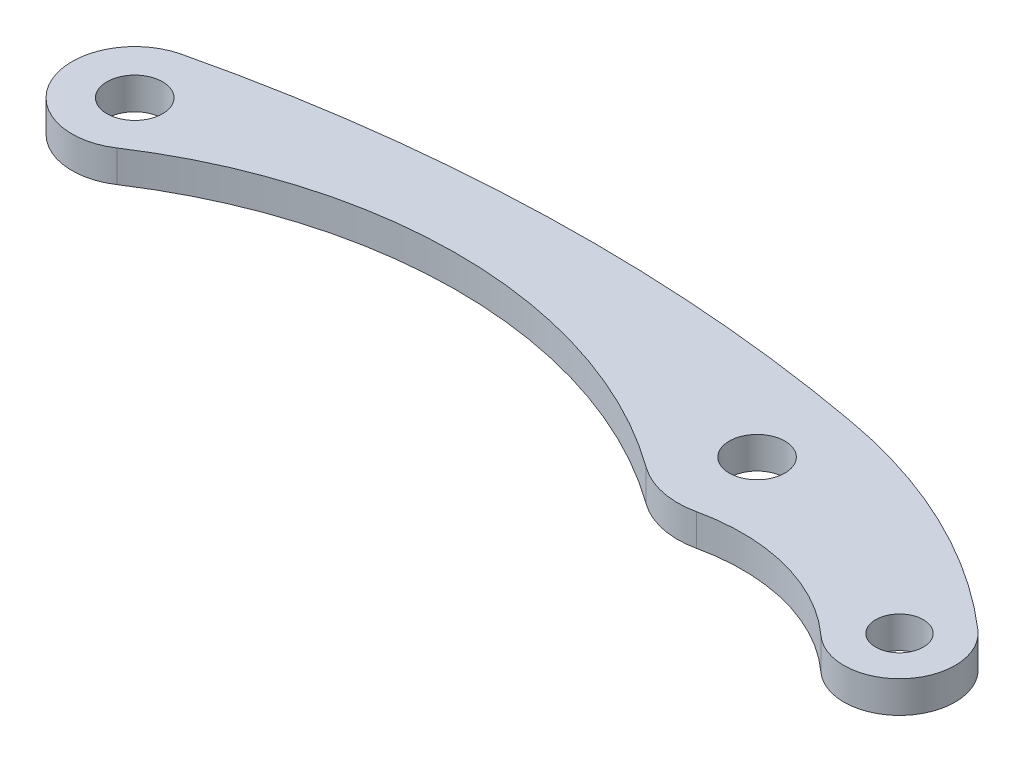
ISO-10303-21;
HEADER;
FILE_DESCRIPTION(('STEP AP214'),'2;1');
FILE_NAME('part.step','',(''),(''),'','','');
FILE_SCHEMA(('AUTOMOTIVE_DESIGN { 1 0 10303 214 1 1 1 1 }'));
ENDSEC;
DATA;
#1=APPLICATION_CONTEXT('core data for automotive mechanical design processes');
#2=APPLICATION_PROTOCOL_DEFINITION('international standard','automotive_design',2000,#1);
#3=PRODUCT_CONTEXT('',#1,'mechanical');
#4=PRODUCT('Part','Part','',(#3));
#5=PRODUCT_RELATED_PRODUCT_CATEGORY('part','',(#4));
#6=PRODUCT_DEFINITION_FORMATION('','',#4);
#7=PRODUCT_DEFINITION_CONTEXT('part definition',#1,'design');
#8=PRODUCT_DEFINITION('design','',#6,#7);
#9=PRODUCT_DEFINITION_SHAPE('','',#8);
#10=(LENGTH_UNIT() NAMED_UNIT(*) SI_UNIT(.MILLI.,.METRE.));
#11=(NAMED_UNIT(*) PLANE_ANGLE_UNIT() SI_UNIT($,.RADIAN.));
#12=(NAMED_UNIT(*) SI_UNIT($,.STERADIAN.) SOLID_ANGLE_UNIT());
#13=UNCERTAINTY_MEASURE_WITH_UNIT(LENGTH_MEASURE(1.E-05),#10,'distance_accuracy_value','');
#14=(GEOMETRIC_REPRESENTATION_CONTEXT(3) GLOBAL_UNCERTAINTY_ASSIGNED_CONTEXT((#13)) GLOBAL_UNIT_ASSIGNED_CONTEXT((#10,
#11,#12)) REPRESENTATION_CONTEXT('',''));
#15=CARTESIAN_POINT('',(0.,0.,0.));
#16=DIRECTION('',(0.,0.,1.));
#17=DIRECTION('',(1.,0.,0.));
#18=AXIS2_PLACEMENT_3D('',#15,#16,#17);
#19=CARTESIAN_POINT('',(39.178405,2.,0.));
#20=DIRECTION('',(0.,-1.,0.));
#21=DIRECTION('',(0.,0.,-1.));
#22=AXIS2_PLACEMENT_3D('',#19,#20,#21);
#23=CYLINDRICAL_SURFACE('',#22,5.);
#24=CARTESIAN_POINT('',(39.178405,0.,0.));
#25=DIRECTION('',(0.,1.,0.));
#26=DIRECTION('',(0.,0.,1.));
#27=AXIS2_PLACEMENT_3D('',#24,#25,#26);
#28=CIRCLE('',#27,5.);
#29=CARTESIAN_POINT('',(36.2479551434965,0.,4.05122989208442));
#30=VERTEX_POINT('',#29);
#31=CARTESIAN_POINT('',(40.257507506043,0.,4.8821652759254));
#32=VERTEX_POINT('',#31);
#33=EDGE_CURVE('E134',#30,#32,#28,.T.);
#34=ORIENTED_EDGE('',*,*,#33,.T.);
#35=DIRECTION('',(0.,-1.,0.));
#36=VECTOR('',#35,1.);
#37=CARTESIAN_POINT('',(40.257507506043,2.,4.8821652759254));
#38=LINE('',#37,#36);
#39=CARTESIAN_POINT('',(40.257507506043,2.,4.8821652759254));
#40=VERTEX_POINT('',#39);
#41=EDGE_CURVE('E11',#40,#32,#38,.T.);
#42=ORIENTED_EDGE('',*,*,#41,.F.);
#43=CARTESIAN_POINT('',(39.178405,2.,0.));
#44=DIRECTION('',(0.,1.,0.));
#45=DIRECTION('',(0.,0.,1.));
#46=AXIS2_PLACEMENT_3D('',#43,#44,#45);
#47=CIRCLE('',#46,5.);
#48=CARTESIAN_POINT('',(36.2479551434965,2.,4.05122989208442));
#49=VERTEX_POINT('',#48);
#50=EDGE_CURVE('E294',#49,#40,#47,.T.);
#51=ORIENTED_EDGE('',*,*,#50,.F.);
#52=DIRECTION('',(0.,-1.,0.));
#53=VECTOR('',#52,1.);
#54=CARTESIAN_POINT('',(36.2479551434965,2.,4.05122989208442));
#55=LINE('',#54,#53);
#56=EDGE_CURVE('E126',#49,#30,#55,.T.);
#57=ORIENTED_EDGE('',*,*,#56,.T.);
#58=EDGE_LOOP('',(#34,#42,#51,#57));
#59=FACE_BOUND('',#58,.T.);
#60=ADVANCED_FACE('F35',(#59),#23,.T.);
#61=CARTESIAN_POINT('',(42.8473535205461,2.,16.5993619381464));
#62=DIRECTION('',(0.,-1.,0.));
#63=DIRECTION('',(0.,0.,-1.));
#64=AXIS2_PLACEMENT_3D('',#61,#62,#63);
#65=CYLINDRICAL_SURFACE('',#64,12.);
#66=CARTESIAN_POINT('',(42.8473535205461,0.,16.5993619381464));
#67=DIRECTION('',(0.,1.,0.));
#68=DIRECTION('',(0.,0.,1.));
#69=AXIS2_PLACEMENT_3D('',#66,#67,#68);
#70=CIRCLE('',#69,12.);
#71=CARTESIAN_POINT('',(50.9194367137661,0.,7.72008984400857));
#72=VERTEX_POINT('',#71);
#73=EDGE_CURVE('E137',#32,#72,#70,.F.);
#74=ORIENTED_EDGE('',*,*,#73,.T.);
#75=DIRECTION('',(0.,-1.,0.));
#76=VECTOR('',#75,1.);
#77=CARTESIAN_POINT('',(50.9194367137661,2.,7.72008984400857));
#78=LINE('',#77,#76);
#79=CARTESIAN_POINT('',(50.9194367137661,2.,7.72008984400857));
#80=VERTEX_POINT('',#79);
#81=EDGE_CURVE('E44',#80,#72,#78,.T.);
#82=ORIENTED_EDGE('',*,*,#81,.F.);
#83=CARTESIAN_POINT('',(42.8473535205461,2.,16.5993619381464));
#84=DIRECTION('',(0.,1.,0.));
#85=DIRECTION('',(0.,0.,1.));
#86=AXIS2_PLACEMENT_3D('',#83,#84,#85);
#87=CIRCLE('',#86,12.);
#88=EDGE_CURVE('E91',#40,#80,#87,.F.);
#89=ORIENTED_EDGE('',*,*,#88,.F.);
#90=ORIENTED_EDGE('',*,*,#41,.T.);
#91=EDGE_LOOP('',(#74,#82,#89,#90));
#92=FACE_BOUND('',#91,.T.);
#93=ADVANCED_FACE('F172',(#92),#65,.F.);
#94=CARTESIAN_POINT('',(53.2737943117886,2.,5.13030214988504));
#95=DIRECTION('',(0.,-1.,0.));
#96=DIRECTION('',(0.,0.,-1.));
#97=AXIS2_PLACEMENT_3D('',#94,#95,#96);
#98=CYLINDRICAL_SURFACE('',#97,3.5);
#99=CARTESIAN_POINT('',(53.2737943117886,0.,5.13030214988504));
#100=DIRECTION('',(0.,1.,0.));
#101=DIRECTION('',(0.,0.,1.));
#102=AXIS2_PLACEMENT_3D('',#99,#100,#101);
#103=CIRCLE('',#102,3.5);
#104=CARTESIAN_POINT('',(55.5761043904865,0.,2.49413669575927));
#105=VERTEX_POINT('',#104);
#106=EDGE_CURVE('E139',#72,#105,#103,.T.);
#107=ORIENTED_EDGE('',*,*,#106,.T.);
#108=DIRECTION('',(0.,-1.,0.));
#109=VECTOR('',#108,1.);
#110=CARTESIAN_POINT('',(55.5761043904865,2.,2.49413669575927));
#111=LINE('',#110,#109);
#112=CARTESIAN_POINT('',(55.5761043904865,2.,2.49413669575927));
#113=VERTEX_POINT('',#112);
#114=EDGE_CURVE('E152',#113,#105,#111,.T.);
#115=ORIENTED_EDGE('',*,*,#114,.F.);
#116=CARTESIAN_POINT('',(53.2737943117886,2.,5.13030214988504));
#117=DIRECTION('',(0.,1.,0.));
#118=DIRECTION('',(0.,0.,1.));
#119=AXIS2_PLACEMENT_3D('',#116,#117,#118);
#120=CIRCLE('',#119,3.5);
#121=EDGE_CURVE('E121',#80,#113,#120,.T.);
#122=ORIENTED_EDGE('',*,*,#121,.F.);
#123=ORIENTED_EDGE('',*,*,#81,.T.);
#124=EDGE_LOOP('',(#107,#115,#122,#123));
#125=FACE_BOUND('',#124,.T.);
#126=ADVANCED_FACE('F157',(#125),#98,.T.);
#127=CARTESIAN_POINT('',(34.5264122423915,2.,26.5962208477663));
#128=DIRECTION('',(0.,-1.,0.));
#129=DIRECTION('',(0.,0.,-1.));
#130=AXIS2_PLACEMENT_3D('',#127,#128,#129);
#131=CYLINDRICAL_SURFACE('',#130,32.);
#132=CARTESIAN_POINT('',(34.5264122423915,0.,26.5962208477663));
#133=DIRECTION('',(0.,1.,0.));
#134=DIRECTION('',(0.,0.,1.));
#135=AXIS2_PLACEMENT_3D('',#132,#133,#134);
#136=CIRCLE('',#135,32.);
#137=CARTESIAN_POINT('',(40.0578049302101,0.,-4.92208645026521));
#138=VERTEX_POINT('',#137);
#139=EDGE_CURVE('E142',#138,#105,#136,.F.);
#140=ORIENTED_EDGE('',*,*,#139,.F.);
#141=DIRECTION('',(0.,-1.,0.));
#142=VECTOR('',#141,1.);
#143=CARTESIAN_POINT('',(40.0578049302101,2.,-4.92208645026521));
#144=LINE('',#143,#142);
#145=CARTESIAN_POINT('',(40.0578049302101,2.,-4.92208645026521));
#146=VERTEX_POINT('',#145);
#147=EDGE_CURVE('E110',#146,#138,#144,.T.);
#148=ORIENTED_EDGE('',*,*,#147,.F.);
#149=CARTESIAN_POINT('',(34.5264122423915,2.,26.5962208477663));
#150=DIRECTION('',(0.,1.,0.));
#151=DIRECTION('',(0.,0.,1.));
#152=AXIS2_PLACEMENT_3D('',#149,#150,#151);
#153=CIRCLE('',#152,32.);
#154=EDGE_CURVE('E119',#146,#113,#153,.F.);
#155=ORIENTED_EDGE('',*,*,#154,.T.);
#156=ORIENTED_EDGE('',*,*,#114,.T.);
#157=EDGE_LOOP('',(#140,#148,#155,#156));
#158=FACE_BOUND('',#157,.T.);
#159=ADVANCED_FACE('F164',(#158),#131,.T.);
#160=CARTESIAN_POINT('',(22.1493182065991,2.,93.4612764891579));
#161=DIRECTION('',(0.,-1.,0.));
#162=DIRECTION('',(0.,0.,-1.));
#163=AXIS2_PLACEMENT_3D('',#160,#161,#162);
#164=CYLINDRICAL_SURFACE('',#163,100.);
#165=CARTESIAN_POINT('',(22.1493182065991,0.,93.4612764891579));
#166=DIRECTION('',(0.,1.,0.));
#167=DIRECTION('',(0.,0.,1.));
#168=AXIS2_PLACEMENT_3D('',#165,#166,#167);
#169=CIRCLE('',#168,100.);
#170=CARTESIAN_POINT('',(-0.910877739886168,0.,-3.8435402616572));
#171=VERTEX_POINT('',#170);
#172=EDGE_CURVE('E109',#171,#138,#169,.F.);
#173=ORIENTED_EDGE('',*,*,#172,.F.);
#174=DIRECTION('',(0.,-1.,0.));
#175=VECTOR('',#174,1.);
#176=CARTESIAN_POINT('',(-0.910877739886168,2.,-3.8435402616572));
#177=LINE('',#176,#175);
#178=CARTESIAN_POINT('',(-0.910877739886168,2.,-3.8435402616572));
#179=VERTEX_POINT('',#178);
#180=EDGE_CURVE('E103',#179,#171,#177,.T.);
#181=ORIENTED_EDGE('',*,*,#180,.F.);
#182=CARTESIAN_POINT('',(22.1493182065991,2.,93.4612764891579));
#183=DIRECTION('',(0.,1.,0.));
#184=DIRECTION('',(0.,0.,1.));
#185=AXIS2_PLACEMENT_3D('',#182,#183,#184);
#186=CIRCLE('',#185,100.);
#187=EDGE_CURVE('E107',#179,#146,#186,.F.);
#188=ORIENTED_EDGE('',*,*,#187,.T.);
#189=ORIENTED_EDGE('',*,*,#147,.T.);
#190=EDGE_LOOP('',(#173,#181,#188,#189));
#191=FACE_BOUND('',#190,.T.);
#192=ADVANCED_FACE('F105',(#191),#164,.T.);
#193=CARTESIAN_POINT('',(0.,2.,0.));
#194=DIRECTION('',(0.,-1.,0.));
#195=DIRECTION('',(0.,0.,-1.));
#196=AXIS2_PLACEMENT_3D('',#193,#194,#195);
#197=CYLINDRICAL_SURFACE('',#196,3.95);
#198=CARTESIAN_POINT('',(0.,0.,0.));
#199=DIRECTION('',(0.,1.,0.));
#200=DIRECTION('',(0.,0.,1.));
#201=AXIS2_PLACEMENT_3D('',#198,#199,#200);
#202=CIRCLE('',#201,3.95);
#203=CARTESIAN_POINT('',(2.17165717872392,0.,3.29945527293474));
#204=VERTEX_POINT('',#203);
#205=EDGE_CURVE('E77',#171,#204,#202,.T.);
#206=ORIENTED_EDGE('',*,*,#205,.T.);
#207=DIRECTION('',(0.,-1.,0.));
#208=VECTOR('',#207,1.);
#209=CARTESIAN_POINT('',(2.17165717872392,2.,3.29945527293474));
#210=LINE('',#209,#208);
#211=CARTESIAN_POINT('',(2.17165717872392,2.,3.29945527293474));
#212=VERTEX_POINT('',#211);
#213=EDGE_CURVE('E111',#212,#204,#210,.T.);
#214=ORIENTED_EDGE('',*,*,#213,.F.);
#215=CARTESIAN_POINT('',(0.,2.,0.));
#216=DIRECTION('',(0.,1.,0.));
#217=DIRECTION('',(0.,0.,1.));
#218=AXIS2_PLACEMENT_3D('',#215,#216,#217);
#219=CIRCLE('',#218,3.95);
#220=EDGE_CURVE('E113',#179,#212,#219,.T.);
#221=ORIENTED_EDGE('',*,*,#220,.F.);
#222=ORIENTED_EDGE('',*,*,#180,.T.);
#223=EDGE_LOOP('',(#206,#214,#221,#222));
#224=FACE_BOUND('',#223,.T.);
#225=ADVANCED_FACE('F114',(#224),#197,.T.);
#226=CARTESIAN_POINT('',(39.178405,2.,0.));
#227=DIRECTION('',(0.,-1.,0.));
#228=DIRECTION('',(0.,0.,-1.));
#229=AXIS2_PLACEMENT_3D('',#226,#227,#228);
#230=CYLINDRICAL_SURFACE('',#229,1.75);
#231=CARTESIAN_POINT('',(39.178405,2.,0.));
#232=DIRECTION('',(0.,1.,0.));
#233=DIRECTION('',(0.,0.,1.));
#234=AXIS2_PLACEMENT_3D('',#231,#232,#233);
#235=CIRCLE('',#234,1.75);
#236=CARTESIAN_POINT('',(39.178405,2.,1.75));
#237=VERTEX_POINT('',#236);
#238=EDGE_CURVE('E194',#237,#237,#235,.T.);
#239=ORIENTED_EDGE('',*,*,#238,.T.);
#240=EDGE_LOOP('',(#239));
#241=FACE_BOUND('',#240,.T.);
#242=CARTESIAN_POINT('',(39.178405,0.,0.));
#243=DIRECTION('',(0.,1.,0.));
#244=DIRECTION('',(0.,0.,1.));
#245=AXIS2_PLACEMENT_3D('',#242,#243,#244);
#246=CIRCLE('',#245,1.75);
#247=CARTESIAN_POINT('',(39.178405,0.,1.75));
#248=VERTEX_POINT('',#247);
#249=EDGE_CURVE('E130',#248,#248,#246,.T.);
#250=ORIENTED_EDGE('',*,*,#249,.F.);
#251=EDGE_LOOP('',(#250));
#252=FACE_BOUND('',#251,.T.);
#253=ADVANCED_FACE('F181',(#241,#252),#230,.F.);
#254=CARTESIAN_POINT('',(0.,2.,0.));
#255=DIRECTION('',(0.,-1.,0.));
#256=DIRECTION('',(0.,0.,-1.));
#257=AXIS2_PLACEMENT_3D('',#254,#255,#256);
#258=CYLINDRICAL_SURFACE('',#257,1.75);
#259=CARTESIAN_POINT('',(0.,2.,0.));
#260=DIRECTION('',(0.,1.,0.));
#261=DIRECTION('',(0.,0.,1.));
#262=AXIS2_PLACEMENT_3D('',#259,#260,#261);
#263=CIRCLE('',#262,1.75);
#264=CARTESIAN_POINT('',(0.,2.,1.75));
#265=VERTEX_POINT('',#264);
#266=EDGE_CURVE('E148',#265,#265,#263,.T.);
#267=ORIENTED_EDGE('',*,*,#266,.T.);
#268=EDGE_LOOP('',(#267));
#269=FACE_BOUND('',#268,.T.);
#270=CARTESIAN_POINT('',(0.,0.,0.));
#271=DIRECTION('',(0.,1.,0.));
#272=DIRECTION('',(0.,0.,1.));
#273=AXIS2_PLACEMENT_3D('',#270,#271,#272);
#274=CIRCLE('',#273,1.75);
#275=CARTESIAN_POINT('',(0.,0.,1.75));
#276=VERTEX_POINT('',#275);
#277=EDGE_CURVE('E127',#276,#276,#274,.T.);
#278=ORIENTED_EDGE('',*,*,#277,.F.);
#279=EDGE_LOOP('',(#278));
#280=FACE_BOUND('',#279,.T.);
#281=ADVANCED_FACE('F37',(#269,#280),#258,.F.);
#282=CARTESIAN_POINT('',(18.6652560044752,2.,28.358609244591));
#283=DIRECTION('',(0.,-1.,0.));
#284=DIRECTION('',(0.,0.,-1.));
#285=AXIS2_PLACEMENT_3D('',#282,#283,#284);
#286=CYLINDRICAL_SURFACE('',#285,30.);
#287=CARTESIAN_POINT('',(18.6652560044752,0.,28.358609244591));
#288=DIRECTION('',(0.,1.,0.));
#289=DIRECTION('',(0.,0.,1.));
#290=AXIS2_PLACEMENT_3D('',#287,#288,#289);
#291=CIRCLE('',#290,30.);
#292=EDGE_CURVE('E83',#204,#30,#291,.F.);
#293=ORIENTED_EDGE('',*,*,#292,.T.);
#294=ORIENTED_EDGE('',*,*,#56,.F.);
#295=CARTESIAN_POINT('',(18.6652560044752,2.,28.358609244591));
#296=DIRECTION('',(0.,1.,0.));
#297=DIRECTION('',(0.,0.,1.));
#298=AXIS2_PLACEMENT_3D('',#295,#296,#297);
#299=CIRCLE('',#298,30.);
#300=EDGE_CURVE('E52',#212,#49,#299,.F.);
#301=ORIENTED_EDGE('',*,*,#300,.F.);
#302=ORIENTED_EDGE('',*,*,#213,.T.);
#303=EDGE_LOOP('',(#293,#294,#301,#302));
#304=FACE_BOUND('',#303,.T.);
#305=ADVANCED_FACE('F188',(#304),#286,.F.);
#306=CARTESIAN_POINT('',(0.,2.,0.));
#307=DIRECTION('',(0.,1.,0.));
#308=DIRECTION('',(0.,0.,1.));
#309=AXIS2_PLACEMENT_3D('',#306,#307,#308);
#310=PLANE('',#309);
#311=CARTESIAN_POINT('',(53.2737943117886,2.,5.13030214988504));
#312=DIRECTION('',(0.,1.,0.));
#313=DIRECTION('',(0.,0.,1.));
#314=AXIS2_PLACEMENT_3D('',#311,#312,#313);
#315=CIRCLE('',#314,1.5);
#316=CARTESIAN_POINT('',(53.2737943117886,2.,6.63030214988504));
#317=VERTEX_POINT('',#316);
#318=EDGE_CURVE('E286',#317,#317,#315,.T.);
#319=ORIENTED_EDGE('',*,*,#318,.F.);
#320=EDGE_LOOP('',(#319));
#321=FACE_BOUND('',#320,.T.);
#322=ORIENTED_EDGE('',*,*,#266,.F.);
#323=EDGE_LOOP('',(#322));
#324=FACE_BOUND('',#323,.T.);
#325=ORIENTED_EDGE('',*,*,#238,.F.);
#326=EDGE_LOOP('',(#325));
#327=FACE_BOUND('',#326,.T.);
#328=ORIENTED_EDGE('',*,*,#50,.T.);
#329=ORIENTED_EDGE('',*,*,#88,.T.);
#330=ORIENTED_EDGE('',*,*,#121,.T.);
#331=ORIENTED_EDGE('',*,*,#154,.F.);
#332=ORIENTED_EDGE('',*,*,#187,.F.);
#333=ORIENTED_EDGE('',*,*,#220,.T.);
#334=ORIENTED_EDGE('',*,*,#300,.T.);
#335=EDGE_LOOP('',(#328,#329,#330,#331,#332,#333,#334));
#336=FACE_BOUND('',#335,.T.);
#337=ADVANCED_FACE('F117',(#321,#324,#327,#336),#310,.T.);
#338=CARTESIAN_POINT('',(0.,0.,0.));
#339=DIRECTION('',(0.,1.,0.));
#340=DIRECTION('',(0.,0.,1.));
#341=AXIS2_PLACEMENT_3D('',#338,#339,#340);
#342=PLANE('',#341);
#343=CARTESIAN_POINT('',(53.2737943117886,0.,5.13030214988504));
#344=DIRECTION('',(0.,1.,0.));
#345=DIRECTION('',(0.,0.,1.));
#346=AXIS2_PLACEMENT_3D('',#343,#344,#345);
#347=CIRCLE('',#346,1.5);
#348=CARTESIAN_POINT('',(53.2737943117886,0.,6.63030214988504));
#349=VERTEX_POINT('',#348);
#350=EDGE_CURVE('E131',#349,#349,#347,.T.);
#351=ORIENTED_EDGE('',*,*,#350,.T.);
#352=EDGE_LOOP('',(#351));
#353=FACE_BOUND('',#352,.T.);
#354=ORIENTED_EDGE('',*,*,#277,.T.);
#355=EDGE_LOOP('',(#354));
#356=FACE_BOUND('',#355,.T.);
#357=ORIENTED_EDGE('',*,*,#249,.T.);
#358=EDGE_LOOP('',(#357));
#359=FACE_BOUND('',#358,.T.);
#360=ORIENTED_EDGE('',*,*,#33,.F.);
#361=ORIENTED_EDGE('',*,*,#292,.F.);
#362=ORIENTED_EDGE('',*,*,#205,.F.);
#363=ORIENTED_EDGE('',*,*,#172,.T.);
#364=ORIENTED_EDGE('',*,*,#139,.T.);
#365=ORIENTED_EDGE('',*,*,#106,.F.);
#366=ORIENTED_EDGE('',*,*,#73,.F.);
#367=EDGE_LOOP('',(#360,#361,#362,#363,#364,#365,#366));
#368=FACE_BOUND('',#367,.T.);
#369=ADVANCED_FACE('F161',(#353,#356,#359,#368),#342,.F.);
#370=CARTESIAN_POINT('',(53.2737943117886,0.,5.13030214988504));
#371=DIRECTION('',(0.,1.,0.));
#372=DIRECTION('',(0.,0.,1.));
#373=AXIS2_PLACEMENT_3D('',#370,#371,#372);
#374=CYLINDRICAL_SURFACE('',#373,1.5);
#375=ORIENTED_EDGE('',*,*,#350,.F.);
#376=EDGE_LOOP('',(#375));
#377=FACE_BOUND('',#376,.T.);
#378=ORIENTED_EDGE('',*,*,#318,.T.);
#379=EDGE_LOOP('',(#378));
#380=FACE_BOUND('',#379,.T.);
#381=ADVANCED_FACE('F198',(#377,#380),#374,.F.);
#382=CLOSED_SHELL('',(#60,#93,#126,#159,#192,#225,#253,#281,#305,#337,#369,#381));
#383=MANIFOLD_SOLID_BREP('B2',#382);
#384=ADVANCED_BREP_SHAPE_REPRESENTATION('',(#18,#383),#14);
#385=SHAPE_DEFINITION_REPRESENTATION(#9,#384);
ENDSEC;
END-ISO-10303-21;
